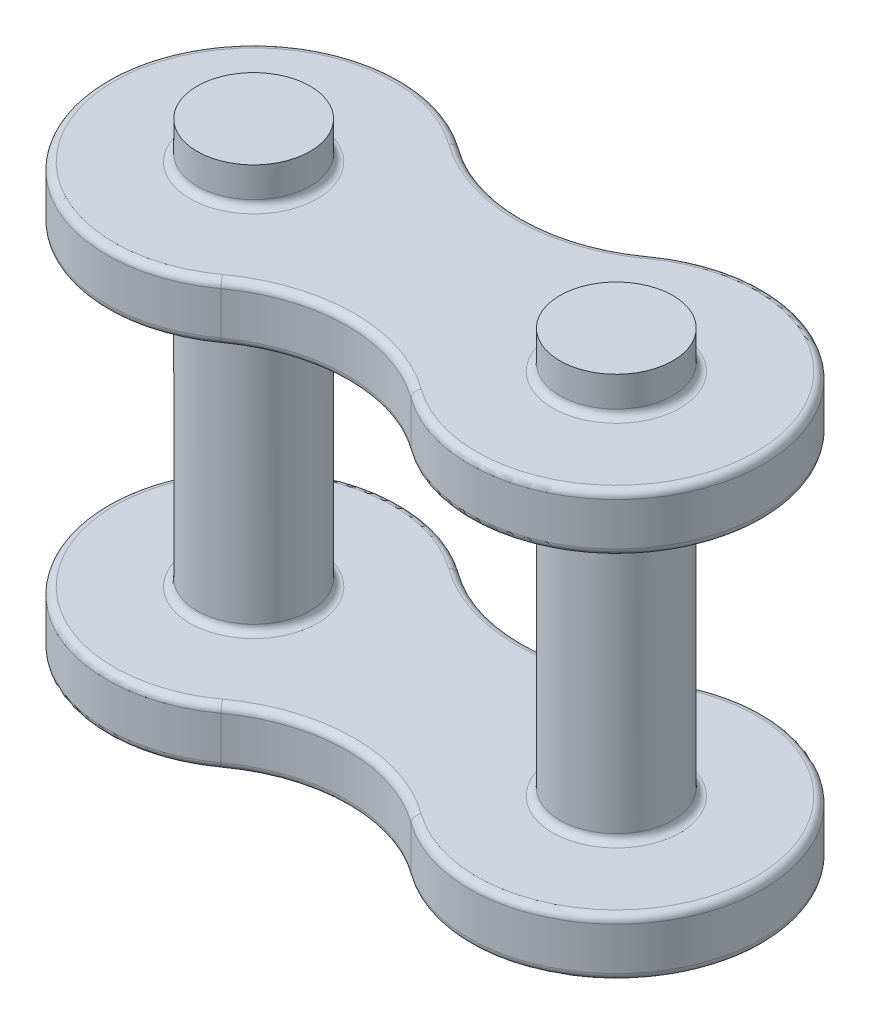
ISO-10303-21;
HEADER;
FILE_DESCRIPTION(('STEP AP214'),'2;1');
FILE_NAME('part.step','',(''),(''),'','','');
FILE_SCHEMA(('AUTOMOTIVE_DESIGN { 1 0 10303 214 1 1 1 1 }'));
ENDSEC;
DATA;
#1=APPLICATION_CONTEXT('core data for automotive mechanical design processes');
#2=APPLICATION_PROTOCOL_DEFINITION('international standard','automotive_design',2000,#1);
#3=PRODUCT_CONTEXT('',#1,'mechanical');
#4=PRODUCT('Part','Part','',(#3));
#5=PRODUCT_RELATED_PRODUCT_CATEGORY('part','',(#4));
#6=PRODUCT_DEFINITION_FORMATION('','',#4);
#7=PRODUCT_DEFINITION_CONTEXT('part definition',#1,'design');
#8=PRODUCT_DEFINITION('design','',#6,#7);
#9=PRODUCT_DEFINITION_SHAPE('','',#8);
#10=(LENGTH_UNIT() NAMED_UNIT(*) SI_UNIT(.MILLI.,.METRE.));
#11=(NAMED_UNIT(*) PLANE_ANGLE_UNIT() SI_UNIT($,.RADIAN.));
#12=(NAMED_UNIT(*) SI_UNIT($,.STERADIAN.) SOLID_ANGLE_UNIT());
#13=UNCERTAINTY_MEASURE_WITH_UNIT(LENGTH_MEASURE(1.E-05),#10,'distance_accuracy_value','');
#14=(GEOMETRIC_REPRESENTATION_CONTEXT(3) GLOBAL_UNCERTAINTY_ASSIGNED_CONTEXT((#13)) GLOBAL_UNIT_ASSIGNED_CONTEXT((#10,
#11,#12)) REPRESENTATION_CONTEXT('',''));
#15=CARTESIAN_POINT('',(0.,0.,0.));
#16=DIRECTION('',(0.,0.,1.));
#17=DIRECTION('',(1.,0.,0.));
#18=AXIS2_PLACEMENT_3D('',#15,#16,#17);
#19=CARTESIAN_POINT('',(3.175,1.0033,-4.37563141450818));
#20=DIRECTION('',(0.,1.,0.));
#21=DIRECTION('',(0.,0.,1.));
#22=AXIS2_PLACEMENT_3D('',#19,#20,#21);
#23=PLANE('',#22);
#24=CARTESIAN_POINT('',(6.35,1.0033,0.));
#25=DIRECTION('',(0.,1.,0.));
#26=DIRECTION('',(0.,0.,1.));
#27=AXIS2_PLACEMENT_3D('',#24,#25,#26);
#28=CIRCLE('',#27,2.234);
#29=CARTESIAN_POINT('',(6.35,1.0033,2.234));
#30=VERTEX_POINT('',#29);
#31=EDGE_CURVE('E238',#30,#30,#28,.F.);
#32=ORIENTED_EDGE('',*,*,#31,.T.);
#33=EDGE_LOOP('',(#32));
#34=FACE_BOUND('',#33,.T.);
#35=CARTESIAN_POINT('',(-6.35,1.0033,0.));
#36=DIRECTION('',(0.,1.,0.));
#37=DIRECTION('',(0.,0.,1.));
#38=AXIS2_PLACEMENT_3D('',#35,#36,#37);
#39=CIRCLE('',#38,2.234);
#40=CARTESIAN_POINT('',(-6.35,1.0033,2.234));
#41=VERTEX_POINT('',#40);
#42=EDGE_CURVE('E235',#41,#41,#39,.F.);
#43=ORIENTED_EDGE('',*,*,#42,.T.);
#44=EDGE_LOOP('',(#43));
#45=FACE_BOUND('',#44,.T.);
#46=CARTESIAN_POINT('',(6.35,1.0033,0.));
#47=DIRECTION('',(0.,1.,0.));
#48=DIRECTION('',(0.,0.,1.));
#49=AXIS2_PLACEMENT_3D('',#46,#47,#48);
#50=CIRCLE('',#49,4.8895);
#51=CARTESIAN_POINT('',(3.47844109205325,1.0033,3.95744357991263));
#52=VERTEX_POINT('',#51);
#53=CARTESIAN_POINT('',(3.47844109205325,1.0033,-3.95744357991263));
#54=VERTEX_POINT('',#53);
#55=EDGE_CURVE('E232',#52,#54,#50,.T.);
#56=ORIENTED_EDGE('',*,*,#55,.T.);
#57=CARTESIAN_POINT('',(0.,1.0033,-8.75126282901636));
#58=DIRECTION('',(0.,1.,0.));
#59=DIRECTION('',(0.,0.,1.));
#60=AXIS2_PLACEMENT_3D('',#57,#58,#59);
#61=CIRCLE('',#60,5.92285872058097);
#62=CARTESIAN_POINT('',(-3.47844109205325,1.0033,-3.95744357991263));
#63=VERTEX_POINT('',#62);
#64=EDGE_CURVE('E161',#54,#63,#61,.F.);
#65=ORIENTED_EDGE('',*,*,#64,.T.);
#66=CARTESIAN_POINT('',(-6.35,1.0033,0.));
#67=DIRECTION('',(0.,1.,0.));
#68=DIRECTION('',(0.,0.,1.));
#69=AXIS2_PLACEMENT_3D('',#66,#67,#68);
#70=CIRCLE('',#69,4.8895);
#71=CARTESIAN_POINT('',(-3.47844109205325,1.0033,3.95744357991263));
#72=VERTEX_POINT('',#71);
#73=EDGE_CURVE('E228',#63,#72,#70,.T.);
#74=ORIENTED_EDGE('',*,*,#73,.T.);
#75=CARTESIAN_POINT('',(0.,1.0033,8.75126282901636));
#76=DIRECTION('',(0.,1.,0.));
#77=DIRECTION('',(0.,0.,1.));
#78=AXIS2_PLACEMENT_3D('',#75,#76,#77);
#79=CIRCLE('',#78,5.92285872058097);
#80=EDGE_CURVE('E230',#72,#52,#79,.F.);
#81=ORIENTED_EDGE('',*,*,#80,.T.);
#82=EDGE_LOOP('',(#56,#65,#74,#81));
#83=FACE_BOUND('',#82,.T.);
#84=ADVANCED_FACE('F36',(#34,#45,#83),#23,.T.);
#85=CARTESIAN_POINT('',(3.175,-1.0033,-4.37563141450818));
#86=DIRECTION('',(0.,1.,0.));
#87=DIRECTION('',(0.,0.,1.));
#88=AXIS2_PLACEMENT_3D('',#85,#86,#87);
#89=PLANE('',#88);
#90=CARTESIAN_POINT('',(-6.35,-1.0033,0.));
#91=DIRECTION('',(0.,1.,0.));
#92=DIRECTION('',(0.,0.,1.));
#93=AXIS2_PLACEMENT_3D('',#90,#91,#92);
#94=CIRCLE('',#93,2.234);
#95=CARTESIAN_POINT('',(-6.35,-1.0033,2.234));
#96=VERTEX_POINT('',#95);
#97=EDGE_CURVE('E217',#96,#96,#94,.T.);
#98=ORIENTED_EDGE('',*,*,#97,.T.);
#99=EDGE_LOOP('',(#98));
#100=FACE_BOUND('',#99,.T.);
#101=CARTESIAN_POINT('',(6.35,-1.0033,0.));
#102=DIRECTION('',(0.,1.,0.));
#103=DIRECTION('',(0.,0.,1.));
#104=AXIS2_PLACEMENT_3D('',#101,#102,#103);
#105=CIRCLE('',#104,2.234);
#106=CARTESIAN_POINT('',(6.35,-1.0033,2.234));
#107=VERTEX_POINT('',#106);
#108=EDGE_CURVE('E214',#107,#107,#105,.T.);
#109=ORIENTED_EDGE('',*,*,#108,.T.);
#110=EDGE_LOOP('',(#109));
#111=FACE_BOUND('',#110,.T.);
#112=CARTESIAN_POINT('',(0.,-1.0033,-8.75126282901636));
#113=DIRECTION('',(0.,1.,0.));
#114=DIRECTION('',(0.,0.,1.));
#115=AXIS2_PLACEMENT_3D('',#112,#113,#114);
#116=CIRCLE('',#115,5.92285872058097);
#117=CARTESIAN_POINT('',(-3.47844109205325,-1.0033,-3.95744357991263));
#118=VERTEX_POINT('',#117);
#119=CARTESIAN_POINT('',(3.47844109205325,-1.0033,-3.95744357991263));
#120=VERTEX_POINT('',#119);
#121=EDGE_CURVE('E205',#118,#120,#116,.T.);
#122=ORIENTED_EDGE('',*,*,#121,.T.);
#123=CARTESIAN_POINT('',(6.35,-1.0033,0.));
#124=DIRECTION('',(0.,1.,0.));
#125=DIRECTION('',(0.,0.,1.));
#126=AXIS2_PLACEMENT_3D('',#123,#124,#125);
#127=CIRCLE('',#126,4.8895);
#128=CARTESIAN_POINT('',(3.47844109205325,-1.0033,3.95744357991263));
#129=VERTEX_POINT('',#128);
#130=EDGE_CURVE('E211',#120,#129,#127,.F.);
#131=ORIENTED_EDGE('',*,*,#130,.T.);
#132=CARTESIAN_POINT('',(0.,-1.0033,8.75126282901636));
#133=DIRECTION('',(0.,1.,0.));
#134=DIRECTION('',(0.,0.,1.));
#135=AXIS2_PLACEMENT_3D('',#132,#133,#134);
#136=CIRCLE('',#135,5.92285872058097);
#137=CARTESIAN_POINT('',(-3.47844109205325,-1.0033,3.95744357991263));
#138=VERTEX_POINT('',#137);
#139=EDGE_CURVE('E209',#129,#138,#136,.T.);
#140=ORIENTED_EDGE('',*,*,#139,.T.);
#141=CARTESIAN_POINT('',(-6.35,-1.0033,0.));
#142=DIRECTION('',(0.,1.,0.));
#143=DIRECTION('',(0.,0.,1.));
#144=AXIS2_PLACEMENT_3D('',#141,#142,#143);
#145=CIRCLE('',#144,4.8895);
#146=EDGE_CURVE('E207',#138,#118,#145,.F.);
#147=ORIENTED_EDGE('',*,*,#146,.T.);
#148=EDGE_LOOP('',(#122,#131,#140,#147));
#149=FACE_BOUND('',#148,.T.);
#150=ADVANCED_FACE('F400',(#100,#111,#149),#89,.F.);
#151=CARTESIAN_POINT('',(0.,1.0033,-8.75126282901636));
#152=DIRECTION('',(0.,-1.,0.));
#153=DIRECTION('',(0.,0.,-1.));
#154=AXIS2_PLACEMENT_3D('',#151,#152,#153);
#155=CYLINDRICAL_SURFACE('',#154,5.66885872058097);
#156=DIRECTION('',(0.,-1.,0.));
#157=VECTOR('',#156,1.);
#158=CARTESIAN_POINT('',(-3.32926920073134,1.0033,-4.16302506458341));
#159=LINE('',#158,#157);
#160=CARTESIAN_POINT('',(-3.32926920073134,0.7493,-4.16302506458341));
#161=VERTEX_POINT('',#160);
#162=CARTESIAN_POINT('',(-3.32926920073134,-0.7493,-4.16302506458341));
#163=VERTEX_POINT('',#162);
#164=EDGE_CURVE('E177',#161,#163,#159,.T.);
#165=ORIENTED_EDGE('',*,*,#164,.F.);
#166=CARTESIAN_POINT('',(0.,0.7493,-8.75126282901636));
#167=DIRECTION('',(0.,1.,0.));
#168=DIRECTION('',(0.,0.,1.));
#169=AXIS2_PLACEMENT_3D('',#166,#167,#168);
#170=CIRCLE('',#169,5.66885872058097);
#171=CARTESIAN_POINT('',(3.32926920073134,0.7493,-4.16302506458341));
#172=VERTEX_POINT('',#171);
#173=EDGE_CURVE('E158',#161,#172,#170,.T.);
#174=ORIENTED_EDGE('',*,*,#173,.T.);
#175=DIRECTION('',(0.,-1.,0.));
#176=VECTOR('',#175,1.);
#177=CARTESIAN_POINT('',(3.32926920073134,1.0033,-4.16302506458341));
#178=LINE('',#177,#176);
#179=CARTESIAN_POINT('',(3.32926920073134,-0.7493,-4.16302506458341));
#180=VERTEX_POINT('',#179);
#181=EDGE_CURVE('E183',#172,#180,#178,.T.);
#182=ORIENTED_EDGE('',*,*,#181,.T.);
#183=CARTESIAN_POINT('',(0.,-0.7493,-8.75126282901636));
#184=DIRECTION('',(0.,1.,0.));
#185=DIRECTION('',(0.,0.,1.));
#186=AXIS2_PLACEMENT_3D('',#183,#184,#185);
#187=CIRCLE('',#186,5.66885872058097);
#188=EDGE_CURVE('E186',#180,#163,#187,.F.);
#189=ORIENTED_EDGE('',*,*,#188,.T.);
#190=EDGE_LOOP('',(#165,#174,#182,#189));
#191=FACE_BOUND('',#190,.T.);
#192=ADVANCED_FACE('F182',(#191),#155,.F.);
#193=CARTESIAN_POINT('',(-6.35,1.0033,0.));
#194=DIRECTION('',(0.,-1.,0.));
#195=DIRECTION('',(0.,0.,-1.));
#196=AXIS2_PLACEMENT_3D('',#193,#194,#195);
#197=CYLINDRICAL_SURFACE('',#196,5.1435);
#198=ORIENTED_EDGE('',*,*,#164,.T.);
#199=CARTESIAN_POINT('',(-6.35,-0.7493,0.));
#200=DIRECTION('',(0.,1.,0.));
#201=DIRECTION('',(0.,0.,1.));
#202=AXIS2_PLACEMENT_3D('',#199,#200,#201);
#203=CIRCLE('',#202,5.1435);
#204=CARTESIAN_POINT('',(-3.32926920073134,-0.7493,4.16302506458341));
#205=VERTEX_POINT('',#204);
#206=EDGE_CURVE('E226',#163,#205,#203,.T.);
#207=ORIENTED_EDGE('',*,*,#206,.T.);
#208=DIRECTION('',(0.,-1.,0.));
#209=VECTOR('',#208,1.);
#210=CARTESIAN_POINT('',(-3.32926920073134,1.0033,4.16302506458341));
#211=LINE('',#210,#209);
#212=CARTESIAN_POINT('',(-3.32926920073134,0.7493,4.16302506458341));
#213=VERTEX_POINT('',#212);
#214=EDGE_CURVE('E194',#213,#205,#211,.T.);
#215=ORIENTED_EDGE('',*,*,#214,.F.);
#216=CARTESIAN_POINT('',(-6.35,0.7493,0.));
#217=DIRECTION('',(0.,1.,0.));
#218=DIRECTION('',(0.,0.,1.));
#219=AXIS2_PLACEMENT_3D('',#216,#217,#218);
#220=CIRCLE('',#219,5.1435);
#221=EDGE_CURVE('E224',#213,#161,#220,.F.);
#222=ORIENTED_EDGE('',*,*,#221,.T.);
#223=EDGE_LOOP('',(#198,#207,#215,#222));
#224=FACE_BOUND('',#223,.T.);
#225=ADVANCED_FACE('F417',(#224),#197,.T.);
#226=CARTESIAN_POINT('',(0.,1.0033,8.75126282901636));
#227=DIRECTION('',(0.,-1.,0.));
#228=DIRECTION('',(0.,0.,-1.));
#229=AXIS2_PLACEMENT_3D('',#226,#227,#228);
#230=CYLINDRICAL_SURFACE('',#229,5.66885872058097);
#231=ORIENTED_EDGE('',*,*,#214,.T.);
#232=CARTESIAN_POINT('',(0.,-0.7493,8.75126282901636));
#233=DIRECTION('',(0.,1.,0.));
#234=DIRECTION('',(0.,0.,1.));
#235=AXIS2_PLACEMENT_3D('',#232,#233,#234);
#236=CIRCLE('',#235,5.66885872058097);
#237=CARTESIAN_POINT('',(3.32926920073134,-0.7493,4.16302506458341));
#238=VERTEX_POINT('',#237);
#239=EDGE_CURVE('E222',#205,#238,#236,.F.);
#240=ORIENTED_EDGE('',*,*,#239,.T.);
#241=DIRECTION('',(0.,-1.,0.));
#242=VECTOR('',#241,1.);
#243=CARTESIAN_POINT('',(3.32926920073134,1.0033,4.16302506458341));
#244=LINE('',#243,#242);
#245=CARTESIAN_POINT('',(3.32926920073134,0.7493,4.16302506458341));
#246=VERTEX_POINT('',#245);
#247=EDGE_CURVE('E191',#246,#238,#244,.T.);
#248=ORIENTED_EDGE('',*,*,#247,.F.);
#249=CARTESIAN_POINT('',(0.,0.7493,8.75126282901636));
#250=DIRECTION('',(0.,1.,0.));
#251=DIRECTION('',(0.,0.,1.));
#252=AXIS2_PLACEMENT_3D('',#249,#250,#251);
#253=CIRCLE('',#252,5.66885872058097);
#254=EDGE_CURVE('E220',#246,#213,#253,.T.);
#255=ORIENTED_EDGE('',*,*,#254,.T.);
#256=EDGE_LOOP('',(#231,#240,#248,#255));
#257=FACE_BOUND('',#256,.T.);
#258=ADVANCED_FACE('F414',(#257),#230,.F.);
#259=CARTESIAN_POINT('',(6.35,1.0033,0.));
#260=DIRECTION('',(0.,-1.,0.));
#261=DIRECTION('',(0.,0.,-1.));
#262=AXIS2_PLACEMENT_3D('',#259,#260,#261);
#263=CYLINDRICAL_SURFACE('',#262,5.1435);
#264=ORIENTED_EDGE('',*,*,#247,.T.);
#265=CARTESIAN_POINT('',(6.35,-0.7493,0.));
#266=DIRECTION('',(0.,1.,0.));
#267=DIRECTION('',(0.,0.,1.));
#268=AXIS2_PLACEMENT_3D('',#265,#266,#267);
#269=CIRCLE('',#268,5.1435);
#270=EDGE_CURVE('E176',#238,#180,#269,.T.);
#271=ORIENTED_EDGE('',*,*,#270,.T.);
#272=ORIENTED_EDGE('',*,*,#181,.F.);
#273=CARTESIAN_POINT('',(6.35,0.7493,0.));
#274=DIRECTION('',(0.,1.,0.));
#275=DIRECTION('',(0.,0.,1.));
#276=AXIS2_PLACEMENT_3D('',#273,#274,#275);
#277=CIRCLE('',#276,5.1435);
#278=EDGE_CURVE('E168',#172,#246,#277,.F.);
#279=ORIENTED_EDGE('',*,*,#278,.T.);
#280=EDGE_LOOP('',(#264,#271,#272,#279));
#281=FACE_BOUND('',#280,.T.);
#282=ADVANCED_FACE('F189',(#281),#263,.T.);
#283=CARTESIAN_POINT('',(-6.35,-2.3114,0.));
#284=DIRECTION('',(0.,1.,0.));
#285=DIRECTION('',(0.,0.,1.));
#286=AXIS2_PLACEMENT_3D('',#283,#284,#285);
#287=PLANE('',#286);
#288=CARTESIAN_POINT('',(-6.35,-2.3114,0.));
#289=DIRECTION('',(0.,1.,0.));
#290=DIRECTION('',(0.,0.,1.));
#291=AXIS2_PLACEMENT_3D('',#288,#289,#290);
#292=CIRCLE('',#291,1.98);
#293=CARTESIAN_POINT('',(-6.35,-2.3114,1.98));
#294=VERTEX_POINT('',#293);
#295=EDGE_CURVE('E197',#294,#294,#292,.T.);
#296=ORIENTED_EDGE('',*,*,#295,.F.);
#297=EDGE_LOOP('',(#296));
#298=FACE_BOUND('',#297,.T.);
#299=ADVANCED_FACE('F413',(#298),#287,.F.);
#300=CARTESIAN_POINT('',(-6.35,15.1892,0.));
#301=DIRECTION('',(0.,-1.,0.));
#302=DIRECTION('',(0.,0.,-1.));
#303=AXIS2_PLACEMENT_3D('',#300,#301,#302);
#304=CYLINDRICAL_SURFACE('',#303,1.98);
#305=CARTESIAN_POINT('',(-6.35,-1.2573,0.));
#306=DIRECTION('',(0.,1.,0.));
#307=DIRECTION('',(0.,0.,1.));
#308=AXIS2_PLACEMENT_3D('',#305,#306,#307);
#309=CIRCLE('',#308,1.98);
#310=CARTESIAN_POINT('',(-6.35,-1.2573,1.98));
#311=VERTEX_POINT('',#310);
#312=EDGE_CURVE('E185',#311,#311,#309,.F.);
#313=ORIENTED_EDGE('',*,*,#312,.T.);
#314=EDGE_LOOP('',(#313));
#315=FACE_BOUND('',#314,.T.);
#316=ORIENTED_EDGE('',*,*,#295,.T.);
#317=EDGE_LOOP('',(#316));
#318=FACE_BOUND('',#317,.T.);
#319=ADVANCED_FACE('F394',(#315,#318),#304,.T.);
#320=CARTESIAN_POINT('',(-6.35,11.6205,0.));
#321=DIRECTION('',(0.,-1.,0.));
#322=DIRECTION('',(0.,0.,-1.));
#323=AXIS2_PLACEMENT_3D('',#320,#321,#322);
#324=CIRCLE('',#323,1.98);
#325=CARTESIAN_POINT('',(-6.35,11.6205,-1.98));
#326=VERTEX_POINT('',#325);
#327=EDGE_CURVE('E11',#326,#326,#324,.T.);
#328=ORIENTED_EDGE('',*,*,#327,.T.);
#329=EDGE_LOOP('',(#328));
#330=FACE_BOUND('',#329,.T.);
#331=CARTESIAN_POINT('',(-6.35,1.2573,0.));
#332=DIRECTION('',(0.,1.,0.));
#333=DIRECTION('',(0.,0.,1.));
#334=AXIS2_PLACEMENT_3D('',#331,#332,#333);
#335=CIRCLE('',#334,1.98);
#336=CARTESIAN_POINT('',(-6.35,1.2573,1.98));
#337=VERTEX_POINT('',#336);
#338=EDGE_CURVE('E250',#337,#337,#335,.T.);
#339=ORIENTED_EDGE('',*,*,#338,.T.);
#340=EDGE_LOOP('',(#339));
#341=FACE_BOUND('',#340,.T.);
#342=ADVANCED_FACE('F384',(#330,#341),#304,.T.);
#343=CARTESIAN_POINT('',(6.35,-2.3114,0.));
#344=DIRECTION('',(0.,-1.,0.));
#345=DIRECTION('',(0.,0.,-1.));
#346=AXIS2_PLACEMENT_3D('',#343,#344,#345);
#347=PLANE('',#346);
#348=CARTESIAN_POINT('',(6.35,-2.3114,0.));
#349=DIRECTION('',(0.,1.,0.));
#350=DIRECTION('',(0.,0.,-1.));
#351=AXIS2_PLACEMENT_3D('',#348,#349,#350);
#352=CIRCLE('',#351,1.98);
#353=CARTESIAN_POINT('',(6.35,-2.3114,-1.98));
#354=VERTEX_POINT('',#353);
#355=EDGE_CURVE('E264',#354,#354,#352,.T.);
#356=ORIENTED_EDGE('',*,*,#355,.F.);
#357=EDGE_LOOP('',(#356));
#358=FACE_BOUND('',#357,.T.);
#359=ADVANCED_FACE('F382',(#358),#347,.T.);
#360=CARTESIAN_POINT('',(6.35,15.1892,0.));
#361=DIRECTION('',(0.,-1.,0.));
#362=DIRECTION('',(0.,0.,-1.));
#363=AXIS2_PLACEMENT_3D('',#360,#361,#362);
#364=CYLINDRICAL_SURFACE('',#363,1.98);
#365=CARTESIAN_POINT('',(6.35,-1.2573,0.));
#366=DIRECTION('',(0.,1.,0.));
#367=DIRECTION('',(0.,0.,1.));
#368=AXIS2_PLACEMENT_3D('',#365,#366,#367);
#369=CIRCLE('',#368,1.98);
#370=CARTESIAN_POINT('',(6.35,-1.2573,1.98));
#371=VERTEX_POINT('',#370);
#372=EDGE_CURVE('E244',#371,#371,#369,.F.);
#373=ORIENTED_EDGE('',*,*,#372,.T.);
#374=EDGE_LOOP('',(#373));
#375=FACE_BOUND('',#374,.T.);
#376=ORIENTED_EDGE('',*,*,#355,.T.);
#377=EDGE_LOOP('',(#376));
#378=FACE_BOUND('',#377,.T.);
#379=ADVANCED_FACE('F380',(#375,#378),#364,.T.);
#380=CARTESIAN_POINT('',(6.35,11.6205,0.));
#381=DIRECTION('',(0.,-1.,0.));
#382=DIRECTION('',(0.,0.,-1.));
#383=AXIS2_PLACEMENT_3D('',#380,#381,#382);
#384=CIRCLE('',#383,1.98);
#385=CARTESIAN_POINT('',(6.35,11.6205,-1.98));
#386=VERTEX_POINT('',#385);
#387=EDGE_CURVE('E45',#386,#386,#384,.T.);
#388=ORIENTED_EDGE('',*,*,#387,.T.);
#389=EDGE_LOOP('',(#388));
#390=FACE_BOUND('',#389,.T.);
#391=CARTESIAN_POINT('',(6.35,1.2573,0.));
#392=DIRECTION('',(0.,1.,0.));
#393=DIRECTION('',(0.,0.,1.));
#394=AXIS2_PLACEMENT_3D('',#391,#392,#393);
#395=CIRCLE('',#394,1.98);
#396=CARTESIAN_POINT('',(6.35,1.2573,1.98));
#397=VERTEX_POINT('',#396);
#398=EDGE_CURVE('E247',#397,#397,#395,.T.);
#399=ORIENTED_EDGE('',*,*,#398,.T.);
#400=EDGE_LOOP('',(#399));
#401=FACE_BOUND('',#400,.T.);
#402=ADVANCED_FACE('F390',(#390,#401),#364,.T.);
#403=CARTESIAN_POINT('',(-6.35,-0.7493,0.));
#404=DIRECTION('',(0.,1.,0.));
#405=DIRECTION('',(0.,0.,1.));
#406=AXIS2_PLACEMENT_3D('',#403,#404,#405);
#407=TOROIDAL_SURFACE('',#406,4.8895,0.254);
#408=CARTESIAN_POINT('',(-3.47844109205325,-0.7493,-3.95744357991263));
#409=DIRECTION('',(0.809375923900732,0.,0.587290910716177));
#410=DIRECTION('',(0.587290910716177,0.,-0.809375923900732));
#411=AXIS2_PLACEMENT_3D('',#408,#409,#410);
#412=CIRCLE('',#411,0.254);
#413=EDGE_CURVE('E258',#118,#163,#412,.T.);
#414=ORIENTED_EDGE('',*,*,#413,.F.);
#415=ORIENTED_EDGE('',*,*,#146,.F.);
#416=CARTESIAN_POINT('',(-3.47844109205325,-0.7493,3.95744357991263));
#417=DIRECTION('',(0.809375923900732,0.,-0.587290910716177));
#418=DIRECTION('',(-0.587290910716177,0.,-0.809375923900732));
#419=AXIS2_PLACEMENT_3D('',#416,#417,#418);
#420=CIRCLE('',#419,0.254);
#421=EDGE_CURVE('E261',#205,#138,#420,.T.);
#422=ORIENTED_EDGE('',*,*,#421,.F.);
#423=ORIENTED_EDGE('',*,*,#206,.F.);
#424=EDGE_LOOP('',(#414,#415,#422,#423));
#425=FACE_BOUND('',#424,.T.);
#426=ADVANCED_FACE('F436',(#425),#407,.T.);
#427=CARTESIAN_POINT('',(0.,-0.7493,8.75126282901636));
#428=DIRECTION('',(0.,1.,0.));
#429=DIRECTION('',(0.,0.,1.));
#430=AXIS2_PLACEMENT_3D('',#427,#428,#429);
#431=TOROIDAL_SURFACE('',#430,5.92285872058097,0.254);
#432=ORIENTED_EDGE('',*,*,#421,.T.);
#433=ORIENTED_EDGE('',*,*,#139,.F.);
#434=CARTESIAN_POINT('',(3.47844109205325,-0.7493,3.95744357991263));
#435=DIRECTION('',(0.809375923900732,0.,0.587290910716177));
#436=DIRECTION('',(0.587290910716177,0.,-0.809375923900732));
#437=AXIS2_PLACEMENT_3D('',#434,#435,#436);
#438=CIRCLE('',#437,0.254);
#439=EDGE_CURVE('E256',#238,#129,#438,.T.);
#440=ORIENTED_EDGE('',*,*,#439,.F.);
#441=ORIENTED_EDGE('',*,*,#239,.F.);
#442=EDGE_LOOP('',(#432,#433,#440,#441));
#443=FACE_BOUND('',#442,.T.);
#444=ADVANCED_FACE('F432',(#443),#431,.T.);
#445=CARTESIAN_POINT('',(0.,-0.7493,-8.75126282901636));
#446=DIRECTION('',(0.,1.,0.));
#447=DIRECTION('',(0.,0.,1.));
#448=AXIS2_PLACEMENT_3D('',#445,#446,#447);
#449=TOROIDAL_SURFACE('',#448,5.92285872058097,0.254);
#450=ORIENTED_EDGE('',*,*,#413,.T.);
#451=ORIENTED_EDGE('',*,*,#188,.F.);
#452=CARTESIAN_POINT('',(3.47844109205325,-0.7493,-3.95744357991263));
#453=DIRECTION('',(0.809375923900732,0.,-0.587290910716177));
#454=DIRECTION('',(-0.587290910716177,0.,-0.809375923900732));
#455=AXIS2_PLACEMENT_3D('',#452,#453,#454);
#456=CIRCLE('',#455,0.254);
#457=EDGE_CURVE('E254',#120,#180,#456,.T.);
#458=ORIENTED_EDGE('',*,*,#457,.F.);
#459=ORIENTED_EDGE('',*,*,#121,.F.);
#460=EDGE_LOOP('',(#450,#451,#458,#459));
#461=FACE_BOUND('',#460,.T.);
#462=ADVANCED_FACE('F428',(#461),#449,.T.);
#463=CARTESIAN_POINT('',(6.35,-0.7493,0.));
#464=DIRECTION('',(0.,1.,0.));
#465=DIRECTION('',(0.,0.,1.));
#466=AXIS2_PLACEMENT_3D('',#463,#464,#465);
#467=TOROIDAL_SURFACE('',#466,4.8895,0.254);
#468=ORIENTED_EDGE('',*,*,#439,.T.);
#469=ORIENTED_EDGE('',*,*,#130,.F.);
#470=ORIENTED_EDGE('',*,*,#457,.T.);
#471=ORIENTED_EDGE('',*,*,#270,.F.);
#472=EDGE_LOOP('',(#468,#469,#470,#471));
#473=FACE_BOUND('',#472,.T.);
#474=ADVANCED_FACE('F424',(#473),#467,.T.);
#475=CARTESIAN_POINT('',(0.,0.7493,8.75126282901636));
#476=DIRECTION('',(0.,1.,0.));
#477=DIRECTION('',(0.,0.,1.));
#478=AXIS2_PLACEMENT_3D('',#475,#476,#477);
#479=TOROIDAL_SURFACE('',#478,5.92285872058097,0.254);
#480=CARTESIAN_POINT('',(-3.47844109205325,0.7493,3.95744357991263));
#481=DIRECTION('',(-0.809375923900732,0.,0.587290910716177));
#482=DIRECTION('',(0.587290910716177,0.,0.809375923900732));
#483=AXIS2_PLACEMENT_3D('',#480,#481,#482);
#484=CIRCLE('',#483,0.254);
#485=EDGE_CURVE('E164',#213,#72,#484,.T.);
#486=ORIENTED_EDGE('',*,*,#485,.F.);
#487=ORIENTED_EDGE('',*,*,#254,.F.);
#488=CARTESIAN_POINT('',(3.47844109205325,0.7493,3.95744357991263));
#489=DIRECTION('',(0.809375923900732,0.,0.587290910716177));
#490=DIRECTION('',(0.587290910716177,0.,-0.809375923900732));
#491=AXIS2_PLACEMENT_3D('',#488,#489,#490);
#492=CIRCLE('',#491,0.254);
#493=EDGE_CURVE('E171',#52,#246,#492,.T.);
#494=ORIENTED_EDGE('',*,*,#493,.F.);
#495=ORIENTED_EDGE('',*,*,#80,.F.);
#496=EDGE_LOOP('',(#486,#487,#494,#495));
#497=FACE_BOUND('',#496,.T.);
#498=ADVANCED_FACE('F427',(#497),#479,.T.);
#499=CARTESIAN_POINT('',(6.35,0.7493,0.));
#500=DIRECTION('',(0.,1.,0.));
#501=DIRECTION('',(0.,0.,1.));
#502=AXIS2_PLACEMENT_3D('',#499,#500,#501);
#503=TOROIDAL_SURFACE('',#502,4.8895,0.254);
#504=ORIENTED_EDGE('',*,*,#493,.T.);
#505=ORIENTED_EDGE('',*,*,#278,.F.);
#506=CARTESIAN_POINT('',(3.47844109205325,0.7493,-3.95744357991263));
#507=DIRECTION('',(-0.809375923900731,0.,0.587290910716178));
#508=DIRECTION('',(0.587290910716178,0.,0.809375923900731));
#509=AXIS2_PLACEMENT_3D('',#506,#507,#508);
#510=CIRCLE('',#509,0.254);
#511=EDGE_CURVE('E154',#54,#172,#510,.T.);
#512=ORIENTED_EDGE('',*,*,#511,.F.);
#513=ORIENTED_EDGE('',*,*,#55,.F.);
#514=EDGE_LOOP('',(#504,#505,#512,#513));
#515=FACE_BOUND('',#514,.T.);
#516=ADVANCED_FACE('F169',(#515),#503,.T.);
#517=CARTESIAN_POINT('',(-6.35,0.7493,0.));
#518=DIRECTION('',(0.,1.,0.));
#519=DIRECTION('',(0.,0.,1.));
#520=AXIS2_PLACEMENT_3D('',#517,#518,#519);
#521=TOROIDAL_SURFACE('',#520,4.8895,0.254);
#522=ORIENTED_EDGE('',*,*,#485,.T.);
#523=ORIENTED_EDGE('',*,*,#73,.F.);
#524=CARTESIAN_POINT('',(-3.47844109205325,0.7493,-3.95744357991263));
#525=DIRECTION('',(0.809375923900732,0.,0.587290910716177));
#526=DIRECTION('',(0.587290910716177,0.,-0.809375923900732));
#527=AXIS2_PLACEMENT_3D('',#524,#525,#526);
#528=CIRCLE('',#527,0.254);
#529=EDGE_CURVE('E165',#161,#63,#528,.T.);
#530=ORIENTED_EDGE('',*,*,#529,.F.);
#531=ORIENTED_EDGE('',*,*,#221,.F.);
#532=EDGE_LOOP('',(#522,#523,#530,#531));
#533=FACE_BOUND('',#532,.T.);
#534=ADVANCED_FACE('F444',(#533),#521,.T.);
#535=CARTESIAN_POINT('',(0.,0.7493,-8.75126282901636));
#536=DIRECTION('',(0.,1.,0.));
#537=DIRECTION('',(0.,0.,1.));
#538=AXIS2_PLACEMENT_3D('',#535,#536,#537);
#539=TOROIDAL_SURFACE('',#538,5.92285872058097,0.254);
#540=ORIENTED_EDGE('',*,*,#511,.T.);
#541=ORIENTED_EDGE('',*,*,#173,.F.);
#542=ORIENTED_EDGE('',*,*,#529,.T.);
#543=ORIENTED_EDGE('',*,*,#64,.F.);
#544=EDGE_LOOP('',(#540,#541,#542,#543));
#545=FACE_BOUND('',#544,.T.);
#546=ADVANCED_FACE('F156',(#545),#539,.T.);
#547=CARTESIAN_POINT('',(-6.35,-1.2573,0.));
#548=DIRECTION('',(0.,1.,0.));
#549=DIRECTION('',(0.,0.,1.));
#550=AXIS2_PLACEMENT_3D('',#547,#548,#549);
#551=TOROIDAL_SURFACE('',#550,2.234,0.254);
#552=ORIENTED_EDGE('',*,*,#97,.F.);
#553=EDGE_LOOP('',(#552));
#554=FACE_BOUND('',#553,.T.);
#555=ORIENTED_EDGE('',*,*,#312,.F.);
#556=EDGE_LOOP('',(#555));
#557=FACE_BOUND('',#556,.T.);
#558=ADVANCED_FACE('F443',(#554,#557),#551,.F.);
#559=CARTESIAN_POINT('',(6.35,-1.2573,0.));
#560=DIRECTION('',(0.,1.,0.));
#561=DIRECTION('',(0.,0.,1.));
#562=AXIS2_PLACEMENT_3D('',#559,#560,#561);
#563=TOROIDAL_SURFACE('',#562,2.234,0.254);
#564=ORIENTED_EDGE('',*,*,#108,.F.);
#565=EDGE_LOOP('',(#564));
#566=FACE_BOUND('',#565,.T.);
#567=ORIENTED_EDGE('',*,*,#372,.F.);
#568=EDGE_LOOP('',(#567));
#569=FACE_BOUND('',#568,.T.);
#570=ADVANCED_FACE('F455',(#566,#569),#563,.F.);
#571=CARTESIAN_POINT('',(6.35,1.2573,0.));
#572=DIRECTION('',(0.,1.,0.));
#573=DIRECTION('',(0.,0.,1.));
#574=AXIS2_PLACEMENT_3D('',#571,#572,#573);
#575=TOROIDAL_SURFACE('',#574,2.234,0.254);
#576=ORIENTED_EDGE('',*,*,#31,.F.);
#577=EDGE_LOOP('',(#576));
#578=FACE_BOUND('',#577,.T.);
#579=ORIENTED_EDGE('',*,*,#398,.F.);
#580=EDGE_LOOP('',(#579));
#581=FACE_BOUND('',#580,.T.);
#582=ADVANCED_FACE('F459',(#578,#581),#575,.F.);
#583=CARTESIAN_POINT('',(-6.35,1.2573,0.));
#584=DIRECTION('',(0.,1.,0.));
#585=DIRECTION('',(0.,0.,1.));
#586=AXIS2_PLACEMENT_3D('',#583,#584,#585);
#587=TOROIDAL_SURFACE('',#586,2.234,0.254);
#588=ORIENTED_EDGE('',*,*,#42,.F.);
#589=EDGE_LOOP('',(#588));
#590=FACE_BOUND('',#589,.T.);
#591=ORIENTED_EDGE('',*,*,#338,.F.);
#592=EDGE_LOOP('',(#591));
#593=FACE_BOUND('',#592,.T.);
#594=ADVANCED_FACE('F463',(#590,#593),#587,.F.);
#595=CARTESIAN_POINT('',(0.,11.8745,-8.75126282901636));
#596=DIRECTION('',(0.,1.,0.));
#597=DIRECTION('',(0.,0.,1.));
#598=AXIS2_PLACEMENT_3D('',#595,#596,#597);
#599=CYLINDRICAL_SURFACE('',#598,5.66885872058097);
#600=DIRECTION('',(0.,1.,0.));
#601=VECTOR('',#600,1.);
#602=CARTESIAN_POINT('',(3.32926920073134,11.8745,-4.16302506458341));
#603=LINE('',#602,#601);
#604=CARTESIAN_POINT('',(3.32926920073134,12.1285,-4.16302506458341));
#605=VERTEX_POINT('',#604);
#606=CARTESIAN_POINT('',(3.32926920073134,13.6271,-4.16302506458341));
#607=VERTEX_POINT('',#606);
#608=EDGE_CURVE('E265',#605,#607,#603,.T.);
#609=ORIENTED_EDGE('',*,*,#608,.F.);
#610=CARTESIAN_POINT('',(0.,12.1285,-8.75126282901636));
#611=DIRECTION('',(0.,-1.,0.));
#612=DIRECTION('',(0.,0.,-1.));
#613=AXIS2_PLACEMENT_3D('',#610,#611,#612);
#614=CIRCLE('',#613,5.66885872058097);
#615=CARTESIAN_POINT('',(-3.32926920073134,12.1285,-4.16302506458341));
#616=VERTEX_POINT('',#615);
#617=EDGE_CURVE('E299',#605,#616,#614,.T.);
#618=ORIENTED_EDGE('',*,*,#617,.T.);
#619=DIRECTION('',(0.,1.,0.));
#620=VECTOR('',#619,1.);
#621=CARTESIAN_POINT('',(-3.32926920073134,11.8745,-4.16302506458341));
#622=LINE('',#621,#620);
#623=CARTESIAN_POINT('',(-3.32926920073134,13.6271,-4.16302506458341));
#624=VERTEX_POINT('',#623);
#625=EDGE_CURVE('E333',#616,#624,#622,.T.);
#626=ORIENTED_EDGE('',*,*,#625,.T.);
#627=CARTESIAN_POINT('',(0.,13.6271,-8.75126282901636));
#628=DIRECTION('',(0.,-1.,0.));
#629=DIRECTION('',(0.,0.,-1.));
#630=AXIS2_PLACEMENT_3D('',#627,#628,#629);
#631=CIRCLE('',#630,5.66885872058097);
#632=EDGE_CURVE('E297',#624,#607,#631,.F.);
#633=ORIENTED_EDGE('',*,*,#632,.T.);
#634=EDGE_LOOP('',(#609,#618,#626,#633));
#635=FACE_BOUND('',#634,.T.);
#636=ADVANCED_FACE('F361',(#635),#599,.F.);
#637=CARTESIAN_POINT('',(6.35,11.8745,0.));
#638=DIRECTION('',(0.,1.,0.));
#639=DIRECTION('',(0.,0.,1.));
#640=AXIS2_PLACEMENT_3D('',#637,#638,#639);
#641=CYLINDRICAL_SURFACE('',#640,5.1435);
#642=ORIENTED_EDGE('',*,*,#608,.T.);
#643=CARTESIAN_POINT('',(6.35,13.6271,0.));
#644=DIRECTION('',(0.,-1.,0.));
#645=DIRECTION('',(0.,0.,-1.));
#646=AXIS2_PLACEMENT_3D('',#643,#644,#645);
#647=CIRCLE('',#646,5.1435);
#648=CARTESIAN_POINT('',(3.32926920073134,13.6271,4.16302506458341));
#649=VERTEX_POINT('',#648);
#650=EDGE_CURVE('E286',#607,#649,#647,.T.);
#651=ORIENTED_EDGE('',*,*,#650,.T.);
#652=DIRECTION('',(0.,1.,0.));
#653=VECTOR('',#652,1.);
#654=CARTESIAN_POINT('',(3.32926920073134,11.8745,4.16302506458341));
#655=LINE('',#654,#653);
#656=CARTESIAN_POINT('',(3.32926920073134,12.1285,4.16302506458341));
#657=VERTEX_POINT('',#656);
#658=EDGE_CURVE('E368',#657,#649,#655,.T.);
#659=ORIENTED_EDGE('',*,*,#658,.F.);
#660=CARTESIAN_POINT('',(6.35,12.1285,0.));
#661=DIRECTION('',(0.,-1.,0.));
#662=DIRECTION('',(0.,0.,-1.));
#663=AXIS2_PLACEMENT_3D('',#660,#661,#662);
#664=CIRCLE('',#663,5.1435);
#665=EDGE_CURVE('E284',#657,#605,#664,.F.);
#666=ORIENTED_EDGE('',*,*,#665,.T.);
#667=EDGE_LOOP('',(#642,#651,#659,#666));
#668=FACE_BOUND('',#667,.T.);
#669=ADVANCED_FACE('F528',(#668),#641,.T.);
#670=CARTESIAN_POINT('',(0.,11.8745,8.75126282901636));
#671=DIRECTION('',(0.,1.,0.));
#672=DIRECTION('',(0.,0.,1.));
#673=AXIS2_PLACEMENT_3D('',#670,#671,#672);
#674=CYLINDRICAL_SURFACE('',#673,5.66885872058097);
#675=ORIENTED_EDGE('',*,*,#658,.T.);
#676=CARTESIAN_POINT('',(0.,13.6271,8.75126282901636));
#677=DIRECTION('',(0.,-1.,0.));
#678=DIRECTION('',(0.,0.,-1.));
#679=AXIS2_PLACEMENT_3D('',#676,#677,#678);
#680=CIRCLE('',#679,5.66885872058097);
#681=CARTESIAN_POINT('',(-3.32926920073134,13.6271,4.16302506458341));
#682=VERTEX_POINT('',#681);
#683=EDGE_CURVE('E291',#649,#682,#680,.F.);
#684=ORIENTED_EDGE('',*,*,#683,.T.);
#685=DIRECTION('',(0.,1.,0.));
#686=VECTOR('',#685,1.);
#687=CARTESIAN_POINT('',(-3.32926920073134,11.8745,4.16302506458341));
#688=LINE('',#687,#686);
#689=CARTESIAN_POINT('',(-3.32926920073134,12.1285,4.16302506458341));
#690=VERTEX_POINT('',#689);
#691=EDGE_CURVE('E366',#690,#682,#688,.T.);
#692=ORIENTED_EDGE('',*,*,#691,.F.);
#693=CARTESIAN_POINT('',(0.,12.1285,8.75126282901636));
#694=DIRECTION('',(0.,-1.,0.));
#695=DIRECTION('',(0.,0.,-1.));
#696=AXIS2_PLACEMENT_3D('',#693,#694,#695);
#697=CIRCLE('',#696,5.66885872058097);
#698=EDGE_CURVE('E289',#690,#657,#697,.T.);
#699=ORIENTED_EDGE('',*,*,#698,.T.);
#700=EDGE_LOOP('',(#675,#684,#692,#699));
#701=FACE_BOUND('',#700,.T.);
#702=ADVANCED_FACE('F523',(#701),#674,.F.);
#703=CARTESIAN_POINT('',(-6.35,11.8745,0.));
#704=DIRECTION('',(0.,1.,0.));
#705=DIRECTION('',(0.,0.,1.));
#706=AXIS2_PLACEMENT_3D('',#703,#704,#705);
#707=CYLINDRICAL_SURFACE('',#706,5.1435);
#708=ORIENTED_EDGE('',*,*,#691,.T.);
#709=CARTESIAN_POINT('',(-6.35,13.6271,0.));
#710=DIRECTION('',(0.,-1.,0.));
#711=DIRECTION('',(0.,0.,-1.));
#712=AXIS2_PLACEMENT_3D('',#709,#710,#711);
#713=CIRCLE('',#712,5.1435);
#714=EDGE_CURVE('E295',#682,#624,#713,.T.);
#715=ORIENTED_EDGE('',*,*,#714,.T.);
#716=ORIENTED_EDGE('',*,*,#625,.F.);
#717=CARTESIAN_POINT('',(-6.35,12.1285,0.));
#718=DIRECTION('',(0.,-1.,0.));
#719=DIRECTION('',(0.,0.,-1.));
#720=AXIS2_PLACEMENT_3D('',#717,#718,#719);
#721=CIRCLE('',#720,5.1435);
#722=EDGE_CURVE('E293',#616,#690,#721,.F.);
#723=ORIENTED_EDGE('',*,*,#722,.T.);
#724=EDGE_LOOP('',(#708,#715,#716,#723));
#725=FACE_BOUND('',#724,.T.);
#726=ADVANCED_FACE('F364',(#725),#707,.T.);
#727=CARTESIAN_POINT('',(3.175,11.8745,-4.37563141450818));
#728=DIRECTION('',(0.,-1.,0.));
#729=DIRECTION('',(0.,0.,1.));
#730=AXIS2_PLACEMENT_3D('',#727,#728,#729);
#731=PLANE('',#730);
#732=CARTESIAN_POINT('',(6.35,11.8745,0.));
#733=DIRECTION('',(0.,-1.,0.));
#734=DIRECTION('',(0.,0.,-1.));
#735=AXIS2_PLACEMENT_3D('',#732,#733,#734);
#736=CIRCLE('',#735,2.234);
#737=CARTESIAN_POINT('',(6.35,11.8745,-2.234));
#738=VERTEX_POINT('',#737);
#739=EDGE_CURVE('E312',#738,#738,#736,.F.);
#740=ORIENTED_EDGE('',*,*,#739,.T.);
#741=EDGE_LOOP('',(#740));
#742=FACE_BOUND('',#741,.T.);
#743=CARTESIAN_POINT('',(-6.35,11.8745,0.));
#744=DIRECTION('',(0.,-1.,0.));
#745=DIRECTION('',(0.,0.,-1.));
#746=AXIS2_PLACEMENT_3D('',#743,#744,#745);
#747=CIRCLE('',#746,2.234);
#748=CARTESIAN_POINT('',(-6.35,11.8745,-2.234));
#749=VERTEX_POINT('',#748);
#750=EDGE_CURVE('E309',#749,#749,#747,.F.);
#751=ORIENTED_EDGE('',*,*,#750,.T.);
#752=EDGE_LOOP('',(#751));
#753=FACE_BOUND('',#752,.T.);
#754=CARTESIAN_POINT('',(-6.35,11.8745,0.));
#755=DIRECTION('',(0.,-1.,0.));
#756=DIRECTION('',(0.,0.,-1.));
#757=AXIS2_PLACEMENT_3D('',#754,#755,#756);
#758=CIRCLE('',#757,4.8895);
#759=CARTESIAN_POINT('',(-3.47844109205325,11.8745,3.95744357991263));
#760=VERTEX_POINT('',#759);
#761=CARTESIAN_POINT('',(-3.47844109205325,11.8745,-3.95744357991263));
#762=VERTEX_POINT('',#761);
#763=EDGE_CURVE('E302',#760,#762,#758,.T.);
#764=ORIENTED_EDGE('',*,*,#763,.T.);
#765=CARTESIAN_POINT('',(0.,11.8745,-8.75126282901636));
#766=DIRECTION('',(0.,-1.,0.));
#767=DIRECTION('',(0.,0.,-1.));
#768=AXIS2_PLACEMENT_3D('',#765,#766,#767);
#769=CIRCLE('',#768,5.92285872058097);
#770=CARTESIAN_POINT('',(3.47844109205325,11.8745,-3.95744357991263));
#771=VERTEX_POINT('',#770);
#772=EDGE_CURVE('E307',#762,#771,#769,.F.);
#773=ORIENTED_EDGE('',*,*,#772,.T.);
#774=CARTESIAN_POINT('',(6.35,11.8745,0.));
#775=DIRECTION('',(0.,-1.,0.));
#776=DIRECTION('',(0.,0.,-1.));
#777=AXIS2_PLACEMENT_3D('',#774,#775,#776);
#778=CIRCLE('',#777,4.8895);
#779=CARTESIAN_POINT('',(3.47844109205325,11.8745,3.95744357991263));
#780=VERTEX_POINT('',#779);
#781=EDGE_CURVE('E60',#771,#780,#778,.T.);
#782=ORIENTED_EDGE('',*,*,#781,.T.);
#783=CARTESIAN_POINT('',(0.,11.8745,8.75126282901636));
#784=DIRECTION('',(0.,-1.,0.));
#785=DIRECTION('',(0.,0.,-1.));
#786=AXIS2_PLACEMENT_3D('',#783,#784,#785);
#787=CIRCLE('',#786,5.92285872058097);
#788=EDGE_CURVE('E304',#780,#760,#787,.F.);
#789=ORIENTED_EDGE('',*,*,#788,.T.);
#790=EDGE_LOOP('',(#764,#773,#782,#789));
#791=FACE_BOUND('',#790,.T.);
#792=ADVANCED_FACE('F350',(#742,#753,#791),#731,.T.);
#793=CARTESIAN_POINT('',(3.175,13.8811,-4.37563141450818));
#794=DIRECTION('',(0.,-1.,0.));
#795=DIRECTION('',(0.,0.,1.));
#796=AXIS2_PLACEMENT_3D('',#793,#794,#795);
#797=PLANE('',#796);
#798=CARTESIAN_POINT('',(-6.35,13.8811,0.));
#799=DIRECTION('',(0.,-1.,0.));
#800=DIRECTION('',(0.,0.,-1.));
#801=AXIS2_PLACEMENT_3D('',#798,#799,#800);
#802=CIRCLE('',#801,2.234);
#803=CARTESIAN_POINT('',(-6.35,13.8811,-2.234));
#804=VERTEX_POINT('',#803);
#805=EDGE_CURVE('E281',#804,#804,#802,.T.);
#806=ORIENTED_EDGE('',*,*,#805,.T.);
#807=EDGE_LOOP('',(#806));
#808=FACE_BOUND('',#807,.T.);
#809=CARTESIAN_POINT('',(6.35,13.8811,0.));
#810=DIRECTION('',(0.,-1.,0.));
#811=DIRECTION('',(0.,0.,-1.));
#812=AXIS2_PLACEMENT_3D('',#809,#810,#811);
#813=CIRCLE('',#812,2.234);
#814=CARTESIAN_POINT('',(6.35,13.8811,-2.234));
#815=VERTEX_POINT('',#814);
#816=EDGE_CURVE('E278',#815,#815,#813,.T.);
#817=ORIENTED_EDGE('',*,*,#816,.T.);
#818=EDGE_LOOP('',(#817));
#819=FACE_BOUND('',#818,.T.);
#820=CARTESIAN_POINT('',(0.,13.8811,8.75126282901636));
#821=DIRECTION('',(0.,-1.,0.));
#822=DIRECTION('',(0.,0.,-1.));
#823=AXIS2_PLACEMENT_3D('',#820,#821,#822);
#824=CIRCLE('',#823,5.92285872058097);
#825=CARTESIAN_POINT('',(-3.47844109205325,13.8811,3.95744357991263));
#826=VERTEX_POINT('',#825);
#827=CARTESIAN_POINT('',(3.47844109205325,13.8811,3.95744357991263));
#828=VERTEX_POINT('',#827);
#829=EDGE_CURVE('E273',#826,#828,#824,.T.);
#830=ORIENTED_EDGE('',*,*,#829,.T.);
#831=CARTESIAN_POINT('',(6.35,13.8811,0.));
#832=DIRECTION('',(0.,-1.,0.));
#833=DIRECTION('',(0.,0.,-1.));
#834=AXIS2_PLACEMENT_3D('',#831,#832,#833);
#835=CIRCLE('',#834,4.8895);
#836=CARTESIAN_POINT('',(3.47844109205325,13.8811,-3.95744357991263));
#837=VERTEX_POINT('',#836);
#838=EDGE_CURVE('E275',#828,#837,#835,.F.);
#839=ORIENTED_EDGE('',*,*,#838,.T.);
#840=CARTESIAN_POINT('',(0.,13.8811,-8.75126282901636));
#841=DIRECTION('',(0.,-1.,0.));
#842=DIRECTION('',(0.,0.,-1.));
#843=AXIS2_PLACEMENT_3D('',#840,#841,#842);
#844=CIRCLE('',#843,5.92285872058097);
#845=CARTESIAN_POINT('',(-3.47844109205325,13.8811,-3.95744357991263));
#846=VERTEX_POINT('',#845);
#847=EDGE_CURVE('E253',#837,#846,#844,.T.);
#848=ORIENTED_EDGE('',*,*,#847,.T.);
#849=CARTESIAN_POINT('',(-6.35,13.8811,0.));
#850=DIRECTION('',(0.,-1.,0.));
#851=DIRECTION('',(0.,0.,-1.));
#852=AXIS2_PLACEMENT_3D('',#849,#850,#851);
#853=CIRCLE('',#852,4.8895);
#854=EDGE_CURVE('E271',#846,#826,#853,.F.);
#855=ORIENTED_EDGE('',*,*,#854,.T.);
#856=EDGE_LOOP('',(#830,#839,#848,#855));
#857=FACE_BOUND('',#856,.T.);
#858=ADVANCED_FACE('F512',(#808,#819,#857),#797,.F.);
#859=CARTESIAN_POINT('',(6.35,15.1892,0.));
#860=DIRECTION('',(0.,-1.,0.));
#861=DIRECTION('',(0.,0.,-1.));
#862=AXIS2_PLACEMENT_3D('',#859,#860,#861);
#863=PLANE('',#862);
#864=CARTESIAN_POINT('',(6.35,15.1892,0.));
#865=DIRECTION('',(0.,1.,0.));
#866=DIRECTION('',(0.,0.,-1.));
#867=AXIS2_PLACEMENT_3D('',#864,#865,#866);
#868=CIRCLE('',#867,1.98);
#869=CARTESIAN_POINT('',(6.35,15.1892,-1.98));
#870=VERTEX_POINT('',#869);
#871=EDGE_CURVE('E374',#870,#870,#868,.T.);
#872=ORIENTED_EDGE('',*,*,#871,.T.);
#873=EDGE_LOOP('',(#872));
#874=FACE_BOUND('',#873,.T.);
#875=ADVANCED_FACE('F520',(#874),#863,.F.);
#876=CARTESIAN_POINT('',(6.35,14.1351,0.));
#877=DIRECTION('',(0.,-1.,0.));
#878=DIRECTION('',(0.,0.,-1.));
#879=AXIS2_PLACEMENT_3D('',#876,#877,#878);
#880=CIRCLE('',#879,1.98);
#881=CARTESIAN_POINT('',(6.35,14.1351,-1.98));
#882=VERTEX_POINT('',#881);
#883=EDGE_CURVE('E318',#882,#882,#880,.F.);
#884=ORIENTED_EDGE('',*,*,#883,.T.);
#885=EDGE_LOOP('',(#884));
#886=FACE_BOUND('',#885,.T.);
#887=ORIENTED_EDGE('',*,*,#871,.F.);
#888=EDGE_LOOP('',(#887));
#889=FACE_BOUND('',#888,.T.);
#890=ADVANCED_FACE('F393',(#886,#889),#364,.T.);
#891=CARTESIAN_POINT('',(-6.35,15.1892,0.));
#892=DIRECTION('',(0.,1.,0.));
#893=DIRECTION('',(0.,0.,1.));
#894=AXIS2_PLACEMENT_3D('',#891,#892,#893);
#895=PLANE('',#894);
#896=CARTESIAN_POINT('',(-6.35,15.1892,0.));
#897=DIRECTION('',(0.,1.,0.));
#898=DIRECTION('',(0.,0.,1.));
#899=AXIS2_PLACEMENT_3D('',#896,#897,#898);
#900=CIRCLE('',#899,1.98);
#901=CARTESIAN_POINT('',(-6.35,15.1892,1.98));
#902=VERTEX_POINT('',#901);
#903=EDGE_CURVE('E192',#902,#902,#900,.T.);
#904=ORIENTED_EDGE('',*,*,#903,.T.);
#905=EDGE_LOOP('',(#904));
#906=FACE_BOUND('',#905,.T.);
#907=ADVANCED_FACE('F539',(#906),#895,.T.);
#908=CARTESIAN_POINT('',(-6.35,14.1351,0.));
#909=DIRECTION('',(0.,-1.,0.));
#910=DIRECTION('',(0.,0.,-1.));
#911=AXIS2_PLACEMENT_3D('',#908,#909,#910);
#912=CIRCLE('',#911,1.98);
#913=CARTESIAN_POINT('',(-6.35,14.1351,-1.98));
#914=VERTEX_POINT('',#913);
#915=EDGE_CURVE('E315',#914,#914,#912,.F.);
#916=ORIENTED_EDGE('',*,*,#915,.T.);
#917=EDGE_LOOP('',(#916));
#918=FACE_BOUND('',#917,.T.);
#919=ORIENTED_EDGE('',*,*,#903,.F.);
#920=EDGE_LOOP('',(#919));
#921=FACE_BOUND('',#920,.T.);
#922=ADVANCED_FACE('F397',(#918,#921),#304,.T.);
#923=CARTESIAN_POINT('',(-6.35,13.6271,0.));
#924=DIRECTION('',(0.,-1.,0.));
#925=DIRECTION('',(0.,0.,-1.));
#926=AXIS2_PLACEMENT_3D('',#923,#924,#925);
#927=TOROIDAL_SURFACE('',#926,4.8895,0.254);
#928=CARTESIAN_POINT('',(-3.47844109205325,13.6271,-3.95744357991263));
#929=DIRECTION('',(0.809375923900732,0.,0.587290910716177));
#930=DIRECTION('',(0.587290910716177,0.,-0.809375923900732));
#931=AXIS2_PLACEMENT_3D('',#928,#929,#930);
#932=CIRCLE('',#931,0.254);
#933=EDGE_CURVE('E327',#624,#846,#932,.T.);
#934=ORIENTED_EDGE('',*,*,#933,.F.);
#935=ORIENTED_EDGE('',*,*,#714,.F.);
#936=CARTESIAN_POINT('',(-3.47844109205325,13.6271,3.95744357991263));
#937=DIRECTION('',(0.809375923900732,0.,-0.587290910716177));
#938=DIRECTION('',(-0.587290910716177,0.,-0.809375923900732));
#939=AXIS2_PLACEMENT_3D('',#936,#937,#938);
#940=CIRCLE('',#939,0.254);
#941=EDGE_CURVE('E330',#826,#682,#940,.T.);
#942=ORIENTED_EDGE('',*,*,#941,.F.);
#943=ORIENTED_EDGE('',*,*,#854,.F.);
#944=EDGE_LOOP('',(#934,#935,#942,#943));
#945=FACE_BOUND('',#944,.T.);
#946=ADVANCED_FACE('F479',(#945),#927,.T.);
#947=CARTESIAN_POINT('',(0.,13.6271,8.75126282901636));
#948=DIRECTION('',(0.,-1.,0.));
#949=DIRECTION('',(0.,0.,-1.));
#950=AXIS2_PLACEMENT_3D('',#947,#948,#949);
#951=TOROIDAL_SURFACE('',#950,5.92285872058097,0.254);
#952=ORIENTED_EDGE('',*,*,#941,.T.);
#953=ORIENTED_EDGE('',*,*,#683,.F.);
#954=CARTESIAN_POINT('',(3.47844109205325,13.6271,3.95744357991263));
#955=DIRECTION('',(0.809375923900732,0.,0.587290910716177));
#956=DIRECTION('',(0.587290910716177,0.,-0.809375923900732));
#957=AXIS2_PLACEMENT_3D('',#954,#955,#956);
#958=CIRCLE('',#957,0.254);
#959=EDGE_CURVE('E325',#828,#649,#958,.T.);
#960=ORIENTED_EDGE('',*,*,#959,.F.);
#961=ORIENTED_EDGE('',*,*,#829,.F.);
#962=EDGE_LOOP('',(#952,#953,#960,#961));
#963=FACE_BOUND('',#962,.T.);
#964=ADVANCED_FACE('F475',(#963),#951,.T.);
#965=CARTESIAN_POINT('',(0.,13.6271,-8.75126282901636));
#966=DIRECTION('',(0.,-1.,0.));
#967=DIRECTION('',(0.,0.,-1.));
#968=AXIS2_PLACEMENT_3D('',#965,#966,#967);
#969=TOROIDAL_SURFACE('',#968,5.92285872058097,0.254);
#970=ORIENTED_EDGE('',*,*,#933,.T.);
#971=ORIENTED_EDGE('',*,*,#847,.F.);
#972=CARTESIAN_POINT('',(3.47844109205325,13.6271,-3.95744357991263));
#973=DIRECTION('',(0.809375923900732,0.,-0.587290910716177));
#974=DIRECTION('',(-0.587290910716177,0.,-0.809375923900732));
#975=AXIS2_PLACEMENT_3D('',#972,#973,#974);
#976=CIRCLE('',#975,0.254);
#977=EDGE_CURVE('E323',#607,#837,#976,.T.);
#978=ORIENTED_EDGE('',*,*,#977,.F.);
#979=ORIENTED_EDGE('',*,*,#632,.F.);
#980=EDGE_LOOP('',(#970,#971,#978,#979));
#981=FACE_BOUND('',#980,.T.);
#982=ADVANCED_FACE('F471',(#981),#969,.T.);
#983=CARTESIAN_POINT('',(6.35,13.6271,0.));
#984=DIRECTION('',(0.,-1.,0.));
#985=DIRECTION('',(0.,0.,-1.));
#986=AXIS2_PLACEMENT_3D('',#983,#984,#985);
#987=TOROIDAL_SURFACE('',#986,4.8895,0.254);
#988=ORIENTED_EDGE('',*,*,#959,.T.);
#989=ORIENTED_EDGE('',*,*,#650,.F.);
#990=ORIENTED_EDGE('',*,*,#977,.T.);
#991=ORIENTED_EDGE('',*,*,#838,.F.);
#992=EDGE_LOOP('',(#988,#989,#990,#991));
#993=FACE_BOUND('',#992,.T.);
#994=ADVANCED_FACE('F468',(#993),#987,.T.);
#995=CARTESIAN_POINT('',(0.,12.1285,8.75126282901636));
#996=DIRECTION('',(0.,-1.,0.));
#997=DIRECTION('',(0.,0.,-1.));
#998=AXIS2_PLACEMENT_3D('',#995,#996,#997);
#999=TOROIDAL_SURFACE('',#998,5.92285872058097,0.254);
#1000=CARTESIAN_POINT('',(-3.47844109205325,12.1285,3.95744357991263));
#1001=DIRECTION('',(-0.809375923900732,0.,0.587290910716177));
#1002=DIRECTION('',(0.587290910716177,0.,0.809375923900732));
#1003=AXIS2_PLACEMENT_3D('',#1000,#1001,#1002);
#1004=CIRCLE('',#1003,0.254);
#1005=EDGE_CURVE('E336',#760,#690,#1004,.T.);
#1006=ORIENTED_EDGE('',*,*,#1005,.F.);
#1007=ORIENTED_EDGE('',*,*,#788,.F.);
#1008=CARTESIAN_POINT('',(3.47844109205325,12.1285,3.95744357991263));
#1009=DIRECTION('',(0.809375923900732,0.,0.587290910716177));
#1010=DIRECTION('',(0.587290910716177,0.,-0.809375923900732));
#1011=AXIS2_PLACEMENT_3D('',#1008,#1009,#1010);
#1012=CIRCLE('',#1011,0.254);
#1013=EDGE_CURVE('E40',#657,#780,#1012,.T.);
#1014=ORIENTED_EDGE('',*,*,#1013,.F.);
#1015=ORIENTED_EDGE('',*,*,#698,.F.);
#1016=EDGE_LOOP('',(#1006,#1007,#1014,#1015));
#1017=FACE_BOUND('',#1016,.T.);
#1018=ADVANCED_FACE('F349',(#1017),#999,.T.);
#1019=CARTESIAN_POINT('',(6.35,12.1285,0.));
#1020=DIRECTION('',(0.,-1.,0.));
#1021=DIRECTION('',(0.,0.,-1.));
#1022=AXIS2_PLACEMENT_3D('',#1019,#1020,#1021);
#1023=TOROIDAL_SURFACE('',#1022,4.8895,0.254);
#1024=ORIENTED_EDGE('',*,*,#1013,.T.);
#1025=ORIENTED_EDGE('',*,*,#781,.F.);
#1026=CARTESIAN_POINT('',(3.47844109205325,12.1285,-3.95744357991263));
#1027=DIRECTION('',(-0.809375923900732,0.,0.587290910716177));
#1028=DIRECTION('',(0.587290910716177,0.,0.809375923900732));
#1029=AXIS2_PLACEMENT_3D('',#1026,#1027,#1028);
#1030=CIRCLE('',#1029,0.254);
#1031=EDGE_CURVE('E53',#605,#771,#1030,.T.);
#1032=ORIENTED_EDGE('',*,*,#1031,.F.);
#1033=ORIENTED_EDGE('',*,*,#665,.F.);
#1034=EDGE_LOOP('',(#1024,#1025,#1032,#1033));
#1035=FACE_BOUND('',#1034,.T.);
#1036=ADVANCED_FACE('F346',(#1035),#1023,.T.);
#1037=CARTESIAN_POINT('',(-6.35,12.1285,0.));
#1038=DIRECTION('',(0.,-1.,0.));
#1039=DIRECTION('',(0.,0.,-1.));
#1040=AXIS2_PLACEMENT_3D('',#1037,#1038,#1039);
#1041=TOROIDAL_SURFACE('',#1040,4.8895,0.254);
#1042=ORIENTED_EDGE('',*,*,#1005,.T.);
#1043=ORIENTED_EDGE('',*,*,#722,.F.);
#1044=CARTESIAN_POINT('',(-3.47844109205325,12.1285,-3.95744357991263));
#1045=DIRECTION('',(0.809375923900733,0.,0.587290910716175));
#1046=DIRECTION('',(0.587290910716175,0.,-0.809375923900734));
#1047=AXIS2_PLACEMENT_3D('',#1044,#1045,#1046);
#1048=CIRCLE('',#1047,0.254);
#1049=EDGE_CURVE('E334',#762,#616,#1048,.T.);
#1050=ORIENTED_EDGE('',*,*,#1049,.F.);
#1051=ORIENTED_EDGE('',*,*,#763,.F.);
#1052=EDGE_LOOP('',(#1042,#1043,#1050,#1051));
#1053=FACE_BOUND('',#1052,.T.);
#1054=ADVANCED_FACE('F353',(#1053),#1041,.T.);
#1055=CARTESIAN_POINT('',(0.,12.1285,-8.75126282901636));
#1056=DIRECTION('',(0.,-1.,0.));
#1057=DIRECTION('',(0.,0.,-1.));
#1058=AXIS2_PLACEMENT_3D('',#1055,#1056,#1057);
#1059=TOROIDAL_SURFACE('',#1058,5.92285872058097,0.254);
#1060=ORIENTED_EDGE('',*,*,#1031,.T.);
#1061=ORIENTED_EDGE('',*,*,#772,.F.);
#1062=ORIENTED_EDGE('',*,*,#1049,.T.);
#1063=ORIENTED_EDGE('',*,*,#617,.F.);
#1064=EDGE_LOOP('',(#1060,#1061,#1062,#1063));
#1065=FACE_BOUND('',#1064,.T.);
#1066=ADVANCED_FACE('F352',(#1065),#1059,.T.);
#1067=CARTESIAN_POINT('',(-6.35,14.1351,0.));
#1068=DIRECTION('',(0.,-1.,0.));
#1069=DIRECTION('',(0.,0.,-1.));
#1070=AXIS2_PLACEMENT_3D('',#1067,#1068,#1069);
#1071=TOROIDAL_SURFACE('',#1070,2.234,0.254);
#1072=ORIENTED_EDGE('',*,*,#915,.F.);
#1073=EDGE_LOOP('',(#1072));
#1074=FACE_BOUND('',#1073,.T.);
#1075=ORIENTED_EDGE('',*,*,#805,.F.);
#1076=EDGE_LOOP('',(#1075));
#1077=FACE_BOUND('',#1076,.T.);
#1078=ADVANCED_FACE('F486',(#1074,#1077),#1071,.F.);
#1079=CARTESIAN_POINT('',(6.35,14.1351,0.));
#1080=DIRECTION('',(0.,-1.,0.));
#1081=DIRECTION('',(0.,0.,-1.));
#1082=AXIS2_PLACEMENT_3D('',#1079,#1080,#1081);
#1083=TOROIDAL_SURFACE('',#1082,2.234,0.254);
#1084=ORIENTED_EDGE('',*,*,#883,.F.);
#1085=EDGE_LOOP('',(#1084));
#1086=FACE_BOUND('',#1085,.T.);
#1087=ORIENTED_EDGE('',*,*,#816,.F.);
#1088=EDGE_LOOP('',(#1087));
#1089=FACE_BOUND('',#1088,.T.);
#1090=ADVANCED_FACE('F495',(#1086,#1089),#1083,.F.);
#1091=CARTESIAN_POINT('',(6.35,11.6205,0.));
#1092=DIRECTION('',(0.,-1.,0.));
#1093=DIRECTION('',(0.,0.,-1.));
#1094=AXIS2_PLACEMENT_3D('',#1091,#1092,#1093);
#1095=TOROIDAL_SURFACE('',#1094,2.234,0.254);
#1096=ORIENTED_EDGE('',*,*,#387,.F.);
#1097=EDGE_LOOP('',(#1096));
#1098=FACE_BOUND('',#1097,.T.);
#1099=ORIENTED_EDGE('',*,*,#739,.F.);
#1100=EDGE_LOOP('',(#1099));
#1101=FACE_BOUND('',#1100,.T.);
#1102=ADVANCED_FACE('F498',(#1098,#1101),#1095,.F.);
#1103=CARTESIAN_POINT('',(-6.35,11.6205,0.));
#1104=DIRECTION('',(0.,-1.,0.));
#1105=DIRECTION('',(0.,0.,-1.));
#1106=AXIS2_PLACEMENT_3D('',#1103,#1104,#1105);
#1107=TOROIDAL_SURFACE('',#1106,2.234,0.254);
#1108=ORIENTED_EDGE('',*,*,#327,.F.);
#1109=EDGE_LOOP('',(#1108));
#1110=FACE_BOUND('',#1109,.T.);
#1111=ORIENTED_EDGE('',*,*,#750,.F.);
#1112=EDGE_LOOP('',(#1111));
#1113=FACE_BOUND('',#1112,.T.);
#1114=ADVANCED_FACE('F38',(#1110,#1113),#1107,.F.);
#1115=CLOSED_SHELL('',(#84,#150,#192,#225,#258,#282,#299,#319,#342,#359,#379,#402,#426,#444,
#462,#474,#498,#516,#534,#546,#558,#570,#582,#594,#636,#669,#702,#726,#792,#858,#875,#890,#907,
#922,#946,#964,#982,#994,#1018,#1036,#1054,#1066,#1078,#1090,#1102,#1114));
#1116=MANIFOLD_SOLID_BREP('B2',#1115);
#1117=ADVANCED_BREP_SHAPE_REPRESENTATION('',(#18,#1116),#14);
#1118=SHAPE_DEFINITION_REPRESENTATION(#9,#1117);
ENDSEC;
END-ISO-10303-21;
